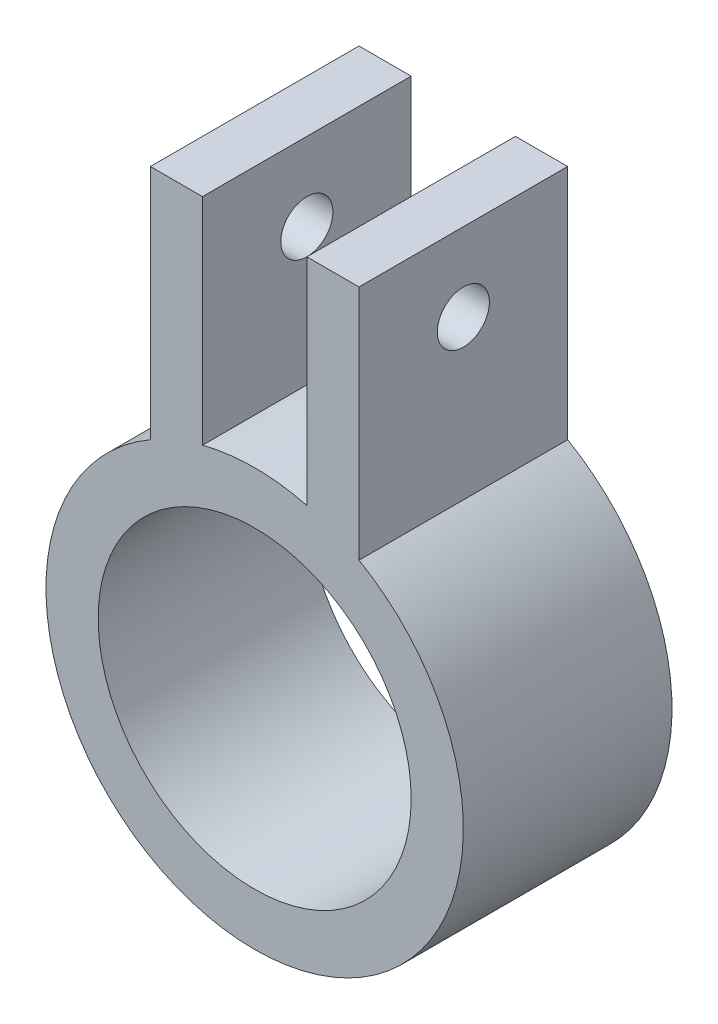
ISO-10303-21;
HEADER;
FILE_DESCRIPTION(('STEP AP214'),'2;1');
FILE_NAME('part.step','',(''),(''),'','','');
FILE_SCHEMA(('AUTOMOTIVE_DESIGN { 1 0 10303 214 1 1 1 1 }'));
ENDSEC;
DATA;
#1=APPLICATION_CONTEXT('core data for automotive mechanical design processes');
#2=APPLICATION_PROTOCOL_DEFINITION('international standard','automotive_design',2000,#1);
#3=PRODUCT_CONTEXT('',#1,'mechanical');
#4=PRODUCT('Part','Part','',(#3));
#5=PRODUCT_RELATED_PRODUCT_CATEGORY('part','',(#4));
#6=PRODUCT_DEFINITION_FORMATION('','',#4);
#7=PRODUCT_DEFINITION_CONTEXT('part definition',#1,'design');
#8=PRODUCT_DEFINITION('design','',#6,#7);
#9=PRODUCT_DEFINITION_SHAPE('','',#8);
#10=(LENGTH_UNIT() NAMED_UNIT(*) SI_UNIT(.MILLI.,.METRE.));
#11=(NAMED_UNIT(*) PLANE_ANGLE_UNIT() SI_UNIT($,.RADIAN.));
#12=(NAMED_UNIT(*) SI_UNIT($,.STERADIAN.) SOLID_ANGLE_UNIT());
#13=UNCERTAINTY_MEASURE_WITH_UNIT(LENGTH_MEASURE(1.E-05),#10,'distance_accuracy_value','');
#14=(GEOMETRIC_REPRESENTATION_CONTEXT(3) GLOBAL_UNCERTAINTY_ASSIGNED_CONTEXT((#13)) GLOBAL_UNIT_ASSIGNED_CONTEXT((#10,
#11,#12)) REPRESENTATION_CONTEXT('',''));
#15=CARTESIAN_POINT('',(0.,0.,0.));
#16=DIRECTION('',(0.,0.,1.));
#17=DIRECTION('',(1.,0.,0.));
#18=AXIS2_PLACEMENT_3D('',#15,#16,#17);
#19=CARTESIAN_POINT('',(0.,0.,4.));
#20=DIRECTION('',(0.,0.,-1.));
#21=DIRECTION('',(-1.,0.,0.));
#22=AXIS2_PLACEMENT_3D('',#19,#20,#21);
#23=CYLINDRICAL_SURFACE('',#22,4.);
#24=CARTESIAN_POINT('',(0.,0.,0.));
#25=DIRECTION('',(0.,0.,1.));
#26=DIRECTION('',(1.,0.,0.));
#27=AXIS2_PLACEMENT_3D('',#24,#25,#26);
#28=CIRCLE('',#27,4.);
#29=CARTESIAN_POINT('',(1.,3.87298334620742,0.));
#30=VERTEX_POINT('',#29);
#31=CARTESIAN_POINT('',(-1.,3.87298334620742,0.));
#32=VERTEX_POINT('',#31);
#33=EDGE_CURVE('E144',#30,#32,#28,.T.);
#34=ORIENTED_EDGE('',*,*,#33,.T.);
#35=DIRECTION('',(0.,0.,-1.));
#36=VECTOR('',#35,1.);
#37=CARTESIAN_POINT('',(-1.,3.87298334620742,4.));
#38=LINE('',#37,#36);
#39=CARTESIAN_POINT('',(-1.,3.87298334620742,4.));
#40=VERTEX_POINT('',#39);
#41=EDGE_CURVE('E11',#40,#32,#38,.T.);
#42=ORIENTED_EDGE('',*,*,#41,.F.);
#43=CARTESIAN_POINT('',(0.,0.,4.));
#44=DIRECTION('',(0.,0.,1.));
#45=DIRECTION('',(1.,0.,0.));
#46=AXIS2_PLACEMENT_3D('',#43,#44,#45);
#47=CIRCLE('',#46,4.);
#48=CARTESIAN_POINT('',(1.,3.87298334620742,4.));
#49=VERTEX_POINT('',#48);
#50=EDGE_CURVE('E99',#49,#40,#47,.T.);
#51=ORIENTED_EDGE('',*,*,#50,.F.);
#52=DIRECTION('',(0.,0.,-1.));
#53=VECTOR('',#52,1.);
#54=CARTESIAN_POINT('',(1.,3.87298334620742,4.));
#55=LINE('',#54,#53);
#56=EDGE_CURVE('E62',#49,#30,#55,.T.);
#57=ORIENTED_EDGE('',*,*,#56,.T.);
#58=EDGE_LOOP('',(#34,#42,#51,#57));
#59=FACE_BOUND('',#58,.T.);
#60=ADVANCED_FACE('F45',(#59),#23,.T.);
#61=CARTESIAN_POINT('',(-1.,0.,4.));
#62=DIRECTION('',(1.,0.,0.));
#63=DIRECTION('',(0.,0.,-1.));
#64=AXIS2_PLACEMENT_3D('',#61,#62,#63);
#65=PLANE('',#64);
#66=CARTESIAN_POINT('',(-1.,6.5,2.));
#67=DIRECTION('',(1.,0.,0.));
#68=DIRECTION('',(0.,0.,-1.));
#69=AXIS2_PLACEMENT_3D('',#66,#67,#68);
#70=CIRCLE('',#69,0.5);
#71=CARTESIAN_POINT('',(-1.,6.5,1.5));
#72=VERTEX_POINT('',#71);
#73=EDGE_CURVE('E147',#72,#72,#70,.T.);
#74=ORIENTED_EDGE('',*,*,#73,.F.);
#75=EDGE_LOOP('',(#74));
#76=FACE_BOUND('',#75,.T.);
#77=DIRECTION('',(0.,-1.,0.));
#78=VECTOR('',#77,1.);
#79=CARTESIAN_POINT('',(-1.,0.,0.));
#80=LINE('',#79,#78);
#81=CARTESIAN_POINT('',(-1.,8.,0.));
#82=VERTEX_POINT('',#81);
#83=EDGE_CURVE('E146',#82,#32,#80,.T.);
#84=ORIENTED_EDGE('',*,*,#83,.F.);
#85=DIRECTION('',(0.,0.,-1.));
#86=VECTOR('',#85,1.);
#87=CARTESIAN_POINT('',(-1.,8.,4.));
#88=LINE('',#87,#86);
#89=CARTESIAN_POINT('',(-1.,8.,4.));
#90=VERTEX_POINT('',#89);
#91=EDGE_CURVE('E54',#90,#82,#88,.T.);
#92=ORIENTED_EDGE('',*,*,#91,.F.);
#93=DIRECTION('',(0.,-1.,0.));
#94=VECTOR('',#93,1.);
#95=CARTESIAN_POINT('',(-1.,0.,4.));
#96=LINE('',#95,#94);
#97=EDGE_CURVE('E190',#90,#40,#96,.T.);
#98=ORIENTED_EDGE('',*,*,#97,.T.);
#99=ORIENTED_EDGE('',*,*,#41,.T.);
#100=EDGE_LOOP('',(#84,#92,#98,#99));
#101=FACE_BOUND('',#100,.T.);
#102=ADVANCED_FACE('F189',(#76,#101),#65,.T.);
#103=CARTESIAN_POINT('',(0.,8.,4.));
#104=DIRECTION('',(0.,-1.,0.));
#105=DIRECTION('',(0.,0.,-1.));
#106=AXIS2_PLACEMENT_3D('',#103,#104,#105);
#107=PLANE('',#106);
#108=DIRECTION('',(-1.,0.,0.));
#109=VECTOR('',#108,1.);
#110=CARTESIAN_POINT('',(0.,8.,0.));
#111=LINE('',#110,#109);
#112=CARTESIAN_POINT('',(-2.,8.,0.));
#113=VERTEX_POINT('',#112);
#114=EDGE_CURVE('E150',#82,#113,#111,.T.);
#115=ORIENTED_EDGE('',*,*,#114,.T.);
#116=DIRECTION('',(0.,0.,-1.));
#117=VECTOR('',#116,1.);
#118=CARTESIAN_POINT('',(-2.,8.,4.));
#119=LINE('',#118,#117);
#120=CARTESIAN_POINT('',(-2.,8.,4.));
#121=VERTEX_POINT('',#120);
#122=EDGE_CURVE('E172',#121,#113,#119,.T.);
#123=ORIENTED_EDGE('',*,*,#122,.F.);
#124=DIRECTION('',(-1.,0.,0.));
#125=VECTOR('',#124,1.);
#126=CARTESIAN_POINT('',(0.,8.,4.));
#127=LINE('',#126,#125);
#128=EDGE_CURVE('E180',#90,#121,#127,.T.);
#129=ORIENTED_EDGE('',*,*,#128,.F.);
#130=ORIENTED_EDGE('',*,*,#91,.T.);
#131=EDGE_LOOP('',(#115,#123,#129,#130));
#132=FACE_BOUND('',#131,.T.);
#133=ADVANCED_FACE('F178',(#132),#107,.F.);
#134=CARTESIAN_POINT('',(-2.,0.,4.));
#135=DIRECTION('',(1.,0.,0.));
#136=DIRECTION('',(0.,0.,-1.));
#137=AXIS2_PLACEMENT_3D('',#134,#135,#136);
#138=PLANE('',#137);
#139=CARTESIAN_POINT('',(-2.,6.5,2.));
#140=DIRECTION('',(-1.,0.,0.));
#141=DIRECTION('',(0.,0.,1.));
#142=AXIS2_PLACEMENT_3D('',#139,#140,#141);
#143=CIRCLE('',#142,0.5);
#144=CARTESIAN_POINT('',(-2.,6.5,2.5));
#145=VERTEX_POINT('',#144);
#146=EDGE_CURVE('E232',#145,#145,#143,.T.);
#147=ORIENTED_EDGE('',*,*,#146,.F.);
#148=EDGE_LOOP('',(#147));
#149=FACE_BOUND('',#148,.T.);
#150=DIRECTION('',(0.,-1.,0.));
#151=VECTOR('',#150,1.);
#152=CARTESIAN_POINT('',(-2.,0.,0.));
#153=LINE('',#152,#151);
#154=CARTESIAN_POINT('',(-2.,3.46410161513775,0.));
#155=VERTEX_POINT('',#154);
#156=EDGE_CURVE('E152',#113,#155,#153,.T.);
#157=ORIENTED_EDGE('',*,*,#156,.T.);
#158=DIRECTION('',(0.,0.,-1.));
#159=VECTOR('',#158,1.);
#160=CARTESIAN_POINT('',(-2.,3.46410161513775,4.));
#161=LINE('',#160,#159);
#162=CARTESIAN_POINT('',(-2.,3.46410161513775,4.));
#163=VERTEX_POINT('',#162);
#164=EDGE_CURVE('E169',#163,#155,#161,.T.);
#165=ORIENTED_EDGE('',*,*,#164,.F.);
#166=DIRECTION('',(0.,-1.,0.));
#167=VECTOR('',#166,1.);
#168=CARTESIAN_POINT('',(-2.,0.,4.));
#169=LINE('',#168,#167);
#170=EDGE_CURVE('E243',#121,#163,#169,.T.);
#171=ORIENTED_EDGE('',*,*,#170,.F.);
#172=ORIENTED_EDGE('',*,*,#122,.T.);
#173=EDGE_LOOP('',(#157,#165,#171,#172));
#174=FACE_BOUND('',#173,.T.);
#175=ADVANCED_FACE('F213',(#149,#174),#138,.F.);
#176=CARTESIAN_POINT('',(0.,0.,4.));
#177=DIRECTION('',(0.,0.,-1.));
#178=DIRECTION('',(-1.,0.,0.));
#179=AXIS2_PLACEMENT_3D('',#176,#177,#178);
#180=CYLINDRICAL_SURFACE('',#179,4.);
#181=CARTESIAN_POINT('',(0.,0.,0.));
#182=DIRECTION('',(0.,0.,1.));
#183=DIRECTION('',(1.,0.,0.));
#184=AXIS2_PLACEMENT_3D('',#181,#182,#183);
#185=CIRCLE('',#184,4.);
#186=CARTESIAN_POINT('',(2.,3.46410161513775,0.));
#187=VERTEX_POINT('',#186);
#188=EDGE_CURVE('E154',#155,#187,#185,.T.);
#189=ORIENTED_EDGE('',*,*,#188,.T.);
#190=DIRECTION('',(0.,0.,-1.));
#191=VECTOR('',#190,1.);
#192=CARTESIAN_POINT('',(2.,3.46410161513775,4.));
#193=LINE('',#192,#191);
#194=CARTESIAN_POINT('',(2.,3.46410161513775,4.));
#195=VERTEX_POINT('',#194);
#196=EDGE_CURVE('E125',#195,#187,#193,.T.);
#197=ORIENTED_EDGE('',*,*,#196,.F.);
#198=CARTESIAN_POINT('',(0.,0.,4.));
#199=DIRECTION('',(0.,0.,1.));
#200=DIRECTION('',(1.,0.,0.));
#201=AXIS2_PLACEMENT_3D('',#198,#199,#200);
#202=CIRCLE('',#201,4.);
#203=EDGE_CURVE('E132',#163,#195,#202,.T.);
#204=ORIENTED_EDGE('',*,*,#203,.F.);
#205=ORIENTED_EDGE('',*,*,#164,.T.);
#206=EDGE_LOOP('',(#189,#197,#204,#205));
#207=FACE_BOUND('',#206,.T.);
#208=ADVANCED_FACE('F219',(#207),#180,.T.);
#209=CARTESIAN_POINT('',(2.,0.,4.));
#210=DIRECTION('',(1.,0.,0.));
#211=DIRECTION('',(0.,0.,-1.));
#212=AXIS2_PLACEMENT_3D('',#209,#210,#211);
#213=PLANE('',#212);
#214=CARTESIAN_POINT('',(2.,6.5,2.));
#215=DIRECTION('',(-1.,0.,0.));
#216=DIRECTION('',(0.,0.,1.));
#217=AXIS2_PLACEMENT_3D('',#214,#215,#216);
#218=CIRCLE('',#217,0.5);
#219=CARTESIAN_POINT('',(2.,6.5,2.5));
#220=VERTEX_POINT('',#219);
#221=EDGE_CURVE('E230',#220,#220,#218,.T.);
#222=ORIENTED_EDGE('',*,*,#221,.T.);
#223=EDGE_LOOP('',(#222));
#224=FACE_BOUND('',#223,.T.);
#225=DIRECTION('',(0.,-1.,0.));
#226=VECTOR('',#225,1.);
#227=CARTESIAN_POINT('',(2.,0.,0.));
#228=LINE('',#227,#226);
#229=CARTESIAN_POINT('',(2.,8.,0.));
#230=VERTEX_POINT('',#229);
#231=EDGE_CURVE('E121',#230,#187,#228,.T.);
#232=ORIENTED_EDGE('',*,*,#231,.F.);
#233=DIRECTION('',(0.,0.,-1.));
#234=VECTOR('',#233,1.);
#235=CARTESIAN_POINT('',(2.,8.,4.));
#236=LINE('',#235,#234);
#237=CARTESIAN_POINT('',(2.,8.,4.));
#238=VERTEX_POINT('',#237);
#239=EDGE_CURVE('E116',#238,#230,#236,.T.);
#240=ORIENTED_EDGE('',*,*,#239,.F.);
#241=DIRECTION('',(0.,-1.,0.));
#242=VECTOR('',#241,1.);
#243=CARTESIAN_POINT('',(2.,0.,4.));
#244=LINE('',#243,#242);
#245=EDGE_CURVE('E119',#238,#195,#244,.T.);
#246=ORIENTED_EDGE('',*,*,#245,.T.);
#247=ORIENTED_EDGE('',*,*,#196,.T.);
#248=EDGE_LOOP('',(#232,#240,#246,#247));
#249=FACE_BOUND('',#248,.T.);
#250=ADVANCED_FACE('F118',(#224,#249),#213,.T.);
#251=CARTESIAN_POINT('',(0.,8.,4.));
#252=DIRECTION('',(0.,1.,0.));
#253=DIRECTION('',(0.,0.,1.));
#254=AXIS2_PLACEMENT_3D('',#251,#252,#253);
#255=PLANE('',#254);
#256=DIRECTION('',(1.,0.,0.));
#257=VECTOR('',#256,1.);
#258=CARTESIAN_POINT('',(0.,8.,0.));
#259=LINE('',#258,#257);
#260=CARTESIAN_POINT('',(1.,8.,0.));
#261=VERTEX_POINT('',#260);
#262=EDGE_CURVE('E158',#261,#230,#259,.T.);
#263=ORIENTED_EDGE('',*,*,#262,.F.);
#264=DIRECTION('',(0.,0.,-1.));
#265=VECTOR('',#264,1.);
#266=CARTESIAN_POINT('',(1.,8.,4.));
#267=LINE('',#266,#265);
#268=CARTESIAN_POINT('',(1.,8.,4.));
#269=VERTEX_POINT('',#268);
#270=EDGE_CURVE('E87',#269,#261,#267,.T.);
#271=ORIENTED_EDGE('',*,*,#270,.F.);
#272=DIRECTION('',(1.,0.,0.));
#273=VECTOR('',#272,1.);
#274=CARTESIAN_POINT('',(0.,8.,4.));
#275=LINE('',#274,#273);
#276=EDGE_CURVE('E130',#269,#238,#275,.T.);
#277=ORIENTED_EDGE('',*,*,#276,.T.);
#278=ORIENTED_EDGE('',*,*,#239,.T.);
#279=EDGE_LOOP('',(#263,#271,#277,#278));
#280=FACE_BOUND('',#279,.T.);
#281=ADVANCED_FACE('F135',(#280),#255,.T.);
#282=CARTESIAN_POINT('',(1.,0.,4.));
#283=DIRECTION('',(-1.,0.,0.));
#284=DIRECTION('',(0.,0.,1.));
#285=AXIS2_PLACEMENT_3D('',#282,#283,#284);
#286=PLANE('',#285);
#287=CARTESIAN_POINT('',(1.,6.5,2.));
#288=DIRECTION('',(-1.,0.,0.));
#289=DIRECTION('',(0.,0.,1.));
#290=AXIS2_PLACEMENT_3D('',#287,#288,#289);
#291=CIRCLE('',#290,0.5);
#292=CARTESIAN_POINT('',(1.,6.5,2.5));
#293=VERTEX_POINT('',#292);
#294=EDGE_CURVE('E48',#293,#293,#291,.T.);
#295=ORIENTED_EDGE('',*,*,#294,.F.);
#296=EDGE_LOOP('',(#295));
#297=FACE_BOUND('',#296,.T.);
#298=DIRECTION('',(0.,1.,0.));
#299=VECTOR('',#298,1.);
#300=CARTESIAN_POINT('',(1.,0.,0.));
#301=LINE('',#300,#299);
#302=EDGE_CURVE('E160',#30,#261,#301,.T.);
#303=ORIENTED_EDGE('',*,*,#302,.F.);
#304=ORIENTED_EDGE('',*,*,#56,.F.);
#305=DIRECTION('',(0.,1.,0.));
#306=VECTOR('',#305,1.);
#307=CARTESIAN_POINT('',(1.,0.,4.));
#308=LINE('',#307,#306);
#309=EDGE_CURVE('E136',#49,#269,#308,.T.);
#310=ORIENTED_EDGE('',*,*,#309,.T.);
#311=ORIENTED_EDGE('',*,*,#270,.T.);
#312=EDGE_LOOP('',(#303,#304,#310,#311));
#313=FACE_BOUND('',#312,.T.);
#314=ADVANCED_FACE('F191',(#297,#313),#286,.T.);
#315=CARTESIAN_POINT('',(0.,0.,4.));
#316=DIRECTION('',(0.,0.,-1.));
#317=DIRECTION('',(-1.,0.,0.));
#318=AXIS2_PLACEMENT_3D('',#315,#316,#317);
#319=CYLINDRICAL_SURFACE('',#318,3.);
#320=CARTESIAN_POINT('',(0.,0.,4.));
#321=DIRECTION('',(0.,0.,1.));
#322=DIRECTION('',(1.,0.,0.));
#323=AXIS2_PLACEMENT_3D('',#320,#321,#322);
#324=CIRCLE('',#323,3.);
#325=CARTESIAN_POINT('',(3.,0.,4.));
#326=VERTEX_POINT('',#325);
#327=EDGE_CURVE('E138',#326,#326,#324,.T.);
#328=ORIENTED_EDGE('',*,*,#327,.T.);
#329=EDGE_LOOP('',(#328));
#330=FACE_BOUND('',#329,.T.);
#331=CARTESIAN_POINT('',(0.,0.,0.));
#332=DIRECTION('',(0.,0.,1.));
#333=DIRECTION('',(1.,0.,0.));
#334=AXIS2_PLACEMENT_3D('',#331,#332,#333);
#335=CIRCLE('',#334,3.);
#336=CARTESIAN_POINT('',(3.,0.,0.));
#337=VERTEX_POINT('',#336);
#338=EDGE_CURVE('E163',#337,#337,#335,.T.);
#339=ORIENTED_EDGE('',*,*,#338,.F.);
#340=EDGE_LOOP('',(#339));
#341=FACE_BOUND('',#340,.T.);
#342=ADVANCED_FACE('F193',(#330,#341),#319,.F.);
#343=CARTESIAN_POINT('',(0.,0.,4.));
#344=DIRECTION('',(0.,0.,1.));
#345=DIRECTION('',(1.,0.,0.));
#346=AXIS2_PLACEMENT_3D('',#343,#344,#345);
#347=PLANE('',#346);
#348=ORIENTED_EDGE('',*,*,#50,.T.);
#349=ORIENTED_EDGE('',*,*,#97,.F.);
#350=ORIENTED_EDGE('',*,*,#128,.T.);
#351=ORIENTED_EDGE('',*,*,#170,.T.);
#352=ORIENTED_EDGE('',*,*,#203,.T.);
#353=ORIENTED_EDGE('',*,*,#245,.F.);
#354=ORIENTED_EDGE('',*,*,#276,.F.);
#355=ORIENTED_EDGE('',*,*,#309,.F.);
#356=EDGE_LOOP('',(#348,#349,#350,#351,#352,#353,#354,#355));
#357=FACE_BOUND('',#356,.T.);
#358=ORIENTED_EDGE('',*,*,#327,.F.);
#359=EDGE_LOOP('',(#358));
#360=FACE_BOUND('',#359,.T.);
#361=ADVANCED_FACE('F128',(#357,#360),#347,.T.);
#362=CARTESIAN_POINT('',(0.,0.,0.));
#363=DIRECTION('',(0.,0.,1.));
#364=DIRECTION('',(1.,0.,0.));
#365=AXIS2_PLACEMENT_3D('',#362,#363,#364);
#366=PLANE('',#365);
#367=ORIENTED_EDGE('',*,*,#33,.F.);
#368=ORIENTED_EDGE('',*,*,#302,.T.);
#369=ORIENTED_EDGE('',*,*,#262,.T.);
#370=ORIENTED_EDGE('',*,*,#231,.T.);
#371=ORIENTED_EDGE('',*,*,#188,.F.);
#372=ORIENTED_EDGE('',*,*,#156,.F.);
#373=ORIENTED_EDGE('',*,*,#114,.F.);
#374=ORIENTED_EDGE('',*,*,#83,.T.);
#375=EDGE_LOOP('',(#367,#368,#369,#370,#371,#372,#373,#374));
#376=FACE_BOUND('',#375,.T.);
#377=ORIENTED_EDGE('',*,*,#338,.T.);
#378=EDGE_LOOP('',(#377));
#379=FACE_BOUND('',#378,.T.);
#380=ADVANCED_FACE('F186',(#376,#379),#366,.F.);
#381=CARTESIAN_POINT('',(2.,6.5,2.));
#382=DIRECTION('',(-1.,0.,0.));
#383=DIRECTION('',(0.,0.,1.));
#384=AXIS2_PLACEMENT_3D('',#381,#382,#383);
#385=CYLINDRICAL_SURFACE('',#384,0.5);
#386=ORIENTED_EDGE('',*,*,#294,.T.);
#387=EDGE_LOOP('',(#386));
#388=FACE_BOUND('',#387,.T.);
#389=ORIENTED_EDGE('',*,*,#221,.F.);
#390=EDGE_LOOP('',(#389));
#391=FACE_BOUND('',#390,.T.);
#392=ADVANCED_FACE('F251',(#388,#391),#385,.F.);
#393=ORIENTED_EDGE('',*,*,#73,.T.);
#394=EDGE_LOOP('',(#393));
#395=FACE_BOUND('',#394,.T.);
#396=ORIENTED_EDGE('',*,*,#146,.T.);
#397=EDGE_LOOP('',(#396));
#398=FACE_BOUND('',#397,.T.);
#399=ADVANCED_FACE('F248',(#395,#398),#385,.F.);
#400=CLOSED_SHELL('',(#60,#102,#133,#175,#208,#250,#281,#314,#342,#361,#380,#392,#399));
#401=MANIFOLD_SOLID_BREP('B2',#400);
#402=ADVANCED_BREP_SHAPE_REPRESENTATION('',(#18,#401),#14);
#403=SHAPE_DEFINITION_REPRESENTATION(#9,#402);
ENDSEC;
END-ISO-10303-21;
